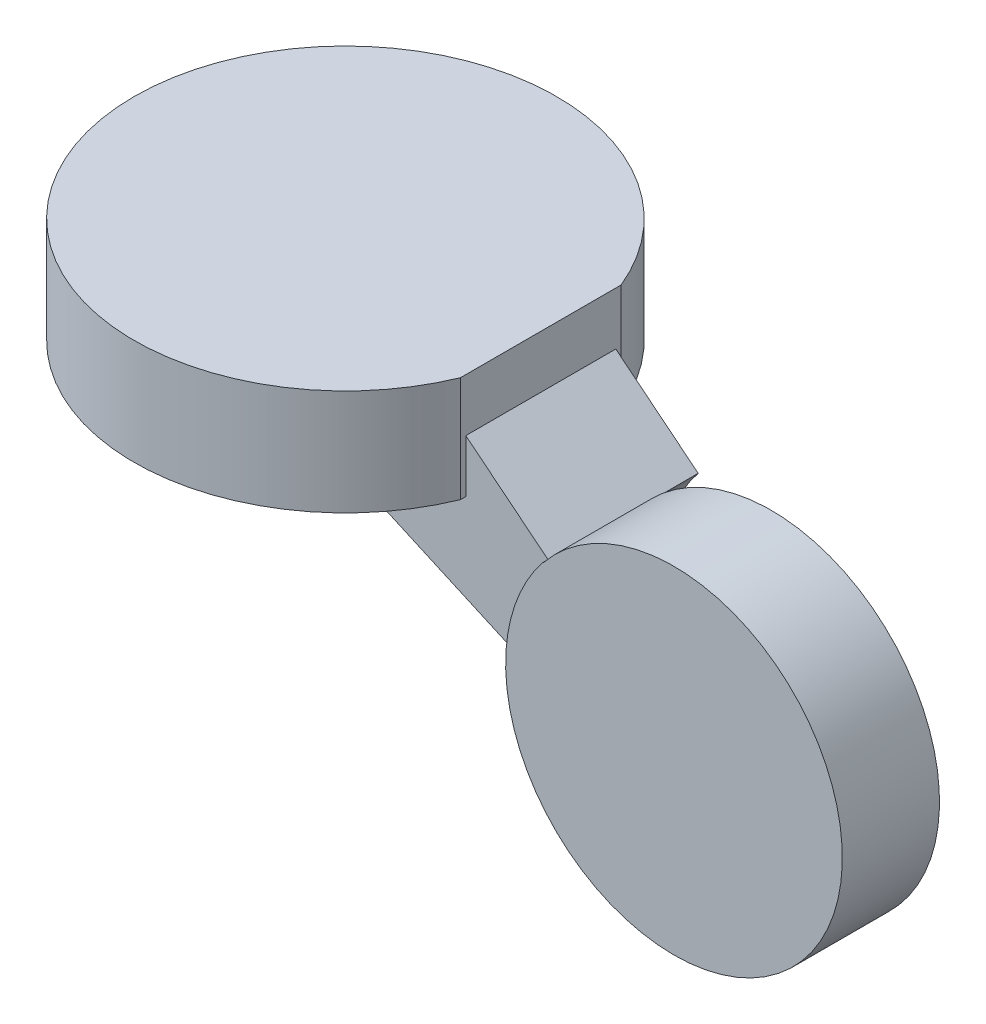
ISO-10303-21;
HEADER;
FILE_DESCRIPTION(('STEP AP214'),'2;1');
FILE_NAME('part.step','',(''),(''),'','','');
FILE_SCHEMA(('AUTOMOTIVE_DESIGN { 1 0 10303 214 1 1 1 1 }'));
ENDSEC;
DATA;
#1=APPLICATION_CONTEXT('core data for automotive mechanical design processes');
#2=APPLICATION_PROTOCOL_DEFINITION('international standard','automotive_design',2000,#1);
#3=PRODUCT_CONTEXT('',#1,'mechanical');
#4=PRODUCT('Part','Part','',(#3));
#5=PRODUCT_RELATED_PRODUCT_CATEGORY('part','',(#4));
#6=PRODUCT_DEFINITION_FORMATION('','',#4);
#7=PRODUCT_DEFINITION_CONTEXT('part definition',#1,'design');
#8=PRODUCT_DEFINITION('design','',#6,#7);
#9=PRODUCT_DEFINITION_SHAPE('','',#8);
#10=(LENGTH_UNIT() NAMED_UNIT(*) SI_UNIT(.MILLI.,.METRE.));
#11=(NAMED_UNIT(*) PLANE_ANGLE_UNIT() SI_UNIT($,.RADIAN.));
#12=(NAMED_UNIT(*) SI_UNIT($,.STERADIAN.) SOLID_ANGLE_UNIT());
#13=UNCERTAINTY_MEASURE_WITH_UNIT(LENGTH_MEASURE(1.E-05),#10,'distance_accuracy_value','');
#14=(GEOMETRIC_REPRESENTATION_CONTEXT(3) GLOBAL_UNCERTAINTY_ASSIGNED_CONTEXT((#13)) GLOBAL_UNIT_ASSIGNED_CONTEXT((#10,
#11,#12)) REPRESENTATION_CONTEXT('',''));
#15=CARTESIAN_POINT('',(0.,0.,0.));
#16=DIRECTION('',(0.,0.,1.));
#17=DIRECTION('',(1.,0.,0.));
#18=AXIS2_PLACEMENT_3D('',#15,#16,#17);
#19=CARTESIAN_POINT('',(185.,50.,-75.9934207678534));
#20=DIRECTION('',(0.627757521800335,0.778408950246015,0.));
#21=DIRECTION('',(-0.778408950246015,0.627757521800335,0.));
#22=AXIS2_PLACEMENT_3D('',#19,#20,#21);
#23=PLANE('',#22);
#24=DIRECTION('',(0.778408950246015,-0.627757521800335,0.));
#25=VECTOR('',#24,1.);
#26=CARTESIAN_POINT('',(185.,50.,-70.9934207678534));
#27=LINE('',#26,#25);
#28=CARTESIAN_POINT('',(185.,50.,-70.9934207678534));
#29=VERTEX_POINT('',#28);
#30=CARTESIAN_POINT('',(263.016769178604,-12.9175880659524,-70.9934207678534));
#31=VERTEX_POINT('',#30);
#32=EDGE_CURVE('E55',#29,#31,#27,.T.);
#33=ORIENTED_EDGE('',*,*,#32,.F.);
#34=DIRECTION('',(0.,0.,1.));
#35=VECTOR('',#34,1.);
#36=CARTESIAN_POINT('',(185.,50.,-75.9934207678534));
#37=LINE('',#36,#35);
#38=CARTESIAN_POINT('',(185.,50.,70.9934207678534));
#39=VERTEX_POINT('',#38);
#40=EDGE_CURVE('E157',#29,#39,#37,.T.);
#41=ORIENTED_EDGE('',*,*,#40,.T.);
#42=DIRECTION('',(-0.778408950246015,0.627757521800335,0.));
#43=VECTOR('',#42,1.);
#44=CARTESIAN_POINT('',(97.3373123204079,120.696658298578,70.9934207678534));
#45=LINE('',#44,#43);
#46=CARTESIAN_POINT('',(262.770904394627,-12.7193073711596,70.9934207678534));
#47=VERTEX_POINT('',#46);
#48=EDGE_CURVE('E347',#47,#39,#45,.T.);
#49=ORIENTED_EDGE('',*,*,#48,.F.);
#50=DIRECTION('',(0.,0.,1.));
#51=VECTOR('',#50,1.);
#52=CARTESIAN_POINT('',(262.770904394627,-12.7193073711596,70.9934207678534));
#53=LINE('',#52,#51);
#54=CARTESIAN_POINT('',(262.770904394627,-12.7193073711596,75.9934207678534));
#55=VERTEX_POINT('',#54);
#56=EDGE_CURVE('E195',#47,#55,#53,.T.);
#57=ORIENTED_EDGE('',*,*,#56,.T.);
#58=DIRECTION('',(-0.778408950246015,0.627757521800335,0.));
#59=VECTOR('',#58,1.);
#60=CARTESIAN_POINT('',(185.,50.,75.9934207678534));
#61=LINE('',#60,#59);
#62=CARTESIAN_POINT('',(263.016769178604,-12.9175880659524,75.9934207678534));
#63=VERTEX_POINT('',#62);
#64=EDGE_CURVE('E152',#63,#55,#61,.T.);
#65=ORIENTED_EDGE('',*,*,#64,.F.);
#66=DIRECTION('',(0.,0.,1.));
#67=VECTOR('',#66,1.);
#68=CARTESIAN_POINT('',(263.016769178604,-12.9175880659524,-75.9934207678534));
#69=LINE('',#68,#67);
#70=CARTESIAN_POINT('',(263.016769178604,-12.9175880659524,-15.9934207678534));
#71=VERTEX_POINT('',#70);
#72=EDGE_CURVE('E146',#71,#63,#69,.T.);
#73=ORIENTED_EDGE('',*,*,#72,.F.);
#74=EDGE_CURVE('E62',#31,#71,#69,.T.);
#75=ORIENTED_EDGE('',*,*,#74,.F.);
#76=EDGE_LOOP('',(#33,#41,#49,#57,#65,#73,#75));
#77=FACE_BOUND('',#76,.T.);
#78=ADVANCED_FACE('F39',(#77),#23,.T.);
#79=CARTESIAN_POINT('',(251.92455713093,-112.966443102881,-75.9934207678534));
#80=DIRECTION('',(-0.409160689592951,-0.91246234447884,0.));
#81=DIRECTION('',(0.91246234447884,-0.409160689592951,0.));
#82=AXIS2_PLACEMENT_3D('',#79,#80,#81);
#83=PLANE('',#82);
#84=DIRECTION('',(-0.91246234447884,0.409160689592951,0.));
#85=VECTOR('',#84,1.);
#86=CARTESIAN_POINT('',(228.060355377864,-102.265406172478,-70.9934207678534));
#87=LINE('',#86,#85);
#88=CARTESIAN_POINT('',(228.060355377864,-102.265406172478,-70.9934207678534));
#89=VERTEX_POINT('',#88);
#90=CARTESIAN_POINT('',(0.,0.,-70.9934207678534));
#91=VERTEX_POINT('',#90);
#92=EDGE_CURVE('E117',#89,#91,#87,.T.);
#93=ORIENTED_EDGE('',*,*,#92,.F.);
#94=DIRECTION('',(0.,0.,1.));
#95=VECTOR('',#94,1.);
#96=CARTESIAN_POINT('',(228.060355377864,-102.265406172478,-75.9934207678534));
#97=LINE('',#96,#95);
#98=CARTESIAN_POINT('',(228.060355377864,-102.265406172478,-15.9934207678534));
#99=VERTEX_POINT('',#98);
#100=EDGE_CURVE('E126',#99,#89,#97,.F.);
#101=ORIENTED_EDGE('',*,*,#100,.F.);
#102=CARTESIAN_POINT('',(228.060355377864,-102.265406172478,70.9934207678534));
#103=VERTEX_POINT('',#102);
#104=EDGE_CURVE('E135',#103,#99,#97,.F.);
#105=ORIENTED_EDGE('',*,*,#104,.F.);
#106=DIRECTION('',(0.91246234447884,-0.409160689592951,0.));
#107=VECTOR('',#106,1.);
#108=CARTESIAN_POINT('',(0.,0.,70.9934207678534));
#109=LINE('',#108,#107);
#110=CARTESIAN_POINT('',(0.,0.,70.9934207678534));
#111=VERTEX_POINT('',#110);
#112=EDGE_CURVE('E348',#111,#103,#109,.T.);
#113=ORIENTED_EDGE('',*,*,#112,.F.);
#114=DIRECTION('',(0.,0.,1.));
#115=VECTOR('',#114,1.);
#116=CARTESIAN_POINT('',(0.,0.,-75.9934207678534));
#117=LINE('',#116,#115);
#118=EDGE_CURVE('E128',#91,#111,#117,.T.);
#119=ORIENTED_EDGE('',*,*,#118,.F.);
#120=EDGE_LOOP('',(#93,#101,#105,#113,#119));
#121=FACE_BOUND('',#120,.T.);
#122=ADVANCED_FACE('F124',(#121),#83,.T.);
#123=CARTESIAN_POINT('',(0.,0.,75.9934207678534));
#124=DIRECTION('',(0.,0.,-1.));
#125=DIRECTION('',(-1.,0.,0.));
#126=AXIS2_PLACEMENT_3D('',#123,#124,#125);
#127=PLANE('',#126);
#128=CARTESIAN_POINT('',(388.832371902994,-113.084659733468,75.9934207678534));
#129=DIRECTION('',(0.,0.,1.));
#130=DIRECTION('',(1.,0.,0.));
#131=AXIS2_PLACEMENT_3D('',#128,#129,#130);
#132=CIRCLE('',#131,161.135649516715);
#133=CARTESIAN_POINT('',(228.060355377864,-102.265406172478,75.9934207678534));
#134=VERTEX_POINT('',#133);
#135=EDGE_CURVE('E350',#55,#134,#132,.T.);
#136=ORIENTED_EDGE('',*,*,#135,.T.);
#137=CARTESIAN_POINT('',(387.075695624063,-112.966443102881,75.9934207678534));
#138=DIRECTION('',(0.,0.,1.));
#139=DIRECTION('',(1.,0.,0.));
#140=AXIS2_PLACEMENT_3D('',#137,#138,#139);
#141=CIRCLE('',#140,159.375);
#142=EDGE_CURVE('E136',#134,#63,#141,.T.);
#143=ORIENTED_EDGE('',*,*,#142,.T.);
#144=ORIENTED_EDGE('',*,*,#64,.T.);
#145=EDGE_LOOP('',(#136,#143,#144));
#146=FACE_BOUND('',#145,.T.);
#147=ADVANCED_FACE('F215',(#146),#127,.F.);
#148=CARTESIAN_POINT('',(387.075695624063,-112.966443102881,-75.9934207678534));
#149=DIRECTION('',(0.,0.,1.));
#150=DIRECTION('',(1.,0.,0.));
#151=AXIS2_PLACEMENT_3D('',#148,#149,#150);
#152=CYLINDRICAL_SURFACE('',#151,159.375);
#153=EDGE_CURVE('E138',#134,#103,#97,.F.);
#154=ORIENTED_EDGE('',*,*,#153,.T.);
#155=ORIENTED_EDGE('',*,*,#104,.T.);
#156=CARTESIAN_POINT('',(387.075695624063,-112.966443102881,-15.9934207678534));
#157=DIRECTION('',(0.,0.,-1.));
#158=DIRECTION('',(-1.,0.,0.));
#159=AXIS2_PLACEMENT_3D('',#156,#157,#158);
#160=CIRCLE('',#159,159.375);
#161=EDGE_CURVE('E11',#99,#71,#160,.F.);
#162=ORIENTED_EDGE('',*,*,#161,.T.);
#163=ORIENTED_EDGE('',*,*,#72,.T.);
#164=ORIENTED_EDGE('',*,*,#142,.F.);
#165=EDGE_LOOP('',(#154,#155,#162,#163,#164));
#166=FACE_BOUND('',#165,.T.);
#167=ADVANCED_FACE('F222',(#166),#152,.T.);
#168=CARTESIAN_POINT('',(0.,0.,0.));
#169=DIRECTION('',(0.,1.,0.));
#170=DIRECTION('',(0.,0.,1.));
#171=AXIS2_PLACEMENT_3D('',#168,#169,#170);
#172=PLANE('',#171);
#173=DIRECTION('',(1.,0.,0.));
#174=VECTOR('',#173,1.);
#175=CARTESIAN_POINT('',(0.,0.,-70.9934207678534));
#176=LINE('',#175,#174);
#177=CARTESIAN_POINT('',(185.,0.,-70.9934207678534));
#178=VERTEX_POINT('',#177);
#179=EDGE_CURVE('E130',#91,#178,#176,.T.);
#180=ORIENTED_EDGE('',*,*,#179,.F.);
#181=ORIENTED_EDGE('',*,*,#118,.T.);
#182=DIRECTION('',(-1.,0.,0.));
#183=VECTOR('',#182,1.);
#184=CARTESIAN_POINT('',(0.,0.,70.9934207678534));
#185=LINE('',#184,#183);
#186=CARTESIAN_POINT('',(185.,0.,70.9934207678534));
#187=VERTEX_POINT('',#186);
#188=EDGE_CURVE('E190',#187,#111,#185,.T.);
#189=ORIENTED_EDGE('',*,*,#188,.F.);
#190=DIRECTION('',(0.,0.,1.));
#191=VECTOR('',#190,1.);
#192=CARTESIAN_POINT('',(185.,0.,70.9934207678534));
#193=LINE('',#192,#191);
#194=CARTESIAN_POINT('',(185.,0.,75.9934207678534));
#195=VERTEX_POINT('',#194);
#196=EDGE_CURVE('E188',#187,#195,#193,.T.);
#197=ORIENTED_EDGE('',*,*,#196,.T.);
#198=CARTESIAN_POINT('',(0.,0.,0.));
#199=DIRECTION('',(0.,1.,0.));
#200=DIRECTION('',(0.,0.,1.));
#201=AXIS2_PLACEMENT_3D('',#198,#199,#200);
#202=CIRCLE('',#201,200.);
#203=CARTESIAN_POINT('',(185.,0.,-75.9934207678534));
#204=VERTEX_POINT('',#203);
#205=EDGE_CURVE('E170',#204,#195,#202,.T.);
#206=ORIENTED_EDGE('',*,*,#205,.F.);
#207=DIRECTION('',(0.,0.,-1.));
#208=VECTOR('',#207,1.);
#209=CARTESIAN_POINT('',(185.,0.,-70.9934207678534));
#210=LINE('',#209,#208);
#211=EDGE_CURVE('E185',#178,#204,#210,.T.);
#212=ORIENTED_EDGE('',*,*,#211,.F.);
#213=EDGE_LOOP('',(#180,#181,#189,#197,#206,#212));
#214=FACE_BOUND('',#213,.T.);
#215=ADVANCED_FACE('F184',(#214),#172,.F.);
#216=CARTESIAN_POINT('',(185.,0.,0.));
#217=DIRECTION('',(1.,0.,0.));
#218=DIRECTION('',(0.,0.,-1.));
#219=AXIS2_PLACEMENT_3D('',#216,#217,#218);
#220=PLANE('',#219);
#221=DIRECTION('',(0.,0.,-1.));
#222=VECTOR('',#221,1.);
#223=CARTESIAN_POINT('',(185.,100.,0.));
#224=LINE('',#223,#222);
#225=CARTESIAN_POINT('',(185.,100.,75.9934207678534));
#226=VERTEX_POINT('',#225);
#227=CARTESIAN_POINT('',(185.,100.,-75.9934207678534));
#228=VERTEX_POINT('',#227);
#229=EDGE_CURVE('E160',#226,#228,#224,.T.);
#230=ORIENTED_EDGE('',*,*,#229,.F.);
#231=DIRECTION('',(0.,1.,0.));
#232=VECTOR('',#231,1.);
#233=CARTESIAN_POINT('',(185.,0.,75.9934207678534));
#234=LINE('',#233,#232);
#235=EDGE_CURVE('E166',#195,#226,#234,.T.);
#236=ORIENTED_EDGE('',*,*,#235,.F.);
#237=ORIENTED_EDGE('',*,*,#196,.F.);
#238=DIRECTION('',(0.,-1.,0.));
#239=VECTOR('',#238,1.);
#240=CARTESIAN_POINT('',(185.,0.,70.9934207678534));
#241=LINE('',#240,#239);
#242=EDGE_CURVE('E356',#39,#187,#241,.T.);
#243=ORIENTED_EDGE('',*,*,#242,.F.);
#244=ORIENTED_EDGE('',*,*,#40,.F.);
#245=DIRECTION('',(0.,1.,0.));
#246=VECTOR('',#245,1.);
#247=CARTESIAN_POINT('',(185.,0.,-70.9934207678534));
#248=LINE('',#247,#246);
#249=EDGE_CURVE('E374',#178,#29,#248,.T.);
#250=ORIENTED_EDGE('',*,*,#249,.F.);
#251=ORIENTED_EDGE('',*,*,#211,.T.);
#252=DIRECTION('',(0.,1.,0.));
#253=VECTOR('',#252,1.);
#254=CARTESIAN_POINT('',(185.,0.,-75.9934207678534));
#255=LINE('',#254,#253);
#256=EDGE_CURVE('E167',#204,#228,#255,.T.);
#257=ORIENTED_EDGE('',*,*,#256,.T.);
#258=EDGE_LOOP('',(#230,#236,#237,#243,#244,#250,#251,#257));
#259=FACE_BOUND('',#258,.T.);
#260=ADVANCED_FACE('F197',(#259),#220,.T.);
#261=CARTESIAN_POINT('',(0.,100.,0.));
#262=DIRECTION('',(0.,-1.,0.));
#263=DIRECTION('',(0.,0.,-1.));
#264=AXIS2_PLACEMENT_3D('',#261,#262,#263);
#265=CYLINDRICAL_SURFACE('',#264,200.);
#266=ORIENTED_EDGE('',*,*,#235,.T.);
#267=CARTESIAN_POINT('',(0.,100.,0.));
#268=DIRECTION('',(0.,1.,0.));
#269=DIRECTION('',(0.,0.,1.));
#270=AXIS2_PLACEMENT_3D('',#267,#268,#269);
#271=CIRCLE('',#270,200.);
#272=EDGE_CURVE('E48',#228,#226,#271,.T.);
#273=ORIENTED_EDGE('',*,*,#272,.F.);
#274=ORIENTED_EDGE('',*,*,#256,.F.);
#275=ORIENTED_EDGE('',*,*,#205,.T.);
#276=EDGE_LOOP('',(#266,#273,#274,#275));
#277=FACE_BOUND('',#276,.T.);
#278=ADVANCED_FACE('F41',(#277),#265,.T.);
#279=CARTESIAN_POINT('',(0.,100.,0.));
#280=DIRECTION('',(0.,1.,0.));
#281=DIRECTION('',(0.,0.,1.));
#282=AXIS2_PLACEMENT_3D('',#279,#280,#281);
#283=PLANE('',#282);
#284=ORIENTED_EDGE('',*,*,#272,.T.);
#285=ORIENTED_EDGE('',*,*,#229,.T.);
#286=EDGE_LOOP('',(#284,#285));
#287=FACE_BOUND('',#286,.T.);
#288=ADVANCED_FACE('F199',(#287),#283,.T.);
#289=CARTESIAN_POINT('',(387.075695624062,-112.966443102881,-15.9934207678534));
#290=DIRECTION('',(0.,0.,-1.));
#291=DIRECTION('',(-1.,0.,0.));
#292=AXIS2_PLACEMENT_3D('',#289,#290,#291);
#293=CYLINDRICAL_SURFACE('',#292,159.375);
#294=ORIENTED_EDGE('',*,*,#100,.T.);
#295=CARTESIAN_POINT('',(387.075695624063,-112.966443102881,-70.9934207678534));
#296=DIRECTION('',(0.,0.,1.));
#297=DIRECTION('',(1.,0.,0.));
#298=AXIS2_PLACEMENT_3D('',#295,#296,#297);
#299=CIRCLE('',#298,159.375000000001);
#300=EDGE_CURVE('E113',#31,#89,#299,.T.);
#301=ORIENTED_EDGE('',*,*,#300,.F.);
#302=ORIENTED_EDGE('',*,*,#74,.T.);
#303=CARTESIAN_POINT('',(387.075695624062,-112.966443102881,-15.9934207678534));
#304=DIRECTION('',(0.,0.,-1.));
#305=DIRECTION('',(-1.,0.,0.));
#306=AXIS2_PLACEMENT_3D('',#303,#304,#305);
#307=CIRCLE('',#306,159.375);
#308=EDGE_CURVE('E133',#99,#71,#307,.T.);
#309=ORIENTED_EDGE('',*,*,#308,.F.);
#310=EDGE_LOOP('',(#294,#301,#302,#309));
#311=FACE_BOUND('',#310,.T.);
#312=ADVANCED_FACE('F132',(#311),#293,.F.);
#313=CARTESIAN_POINT('',(387.075695624062,-112.966443102881,-15.9934207678534));
#314=DIRECTION('',(0.,0.,-1.));
#315=DIRECTION('',(-1.,0.,0.));
#316=AXIS2_PLACEMENT_3D('',#313,#314,#315);
#317=PLANE('',#316);
#318=ORIENTED_EDGE('',*,*,#308,.T.);
#319=ORIENTED_EDGE('',*,*,#161,.F.);
#320=EDGE_LOOP('',(#318,#319));
#321=FACE_BOUND('',#320,.T.);
#322=ADVANCED_FACE('F206',(#321),#317,.T.);
#323=CARTESIAN_POINT('',(388.832371902994,-113.084659733468,70.9934207678534));
#324=DIRECTION('',(0.,0.,1.));
#325=DIRECTION('',(1.,0.,0.));
#326=AXIS2_PLACEMENT_3D('',#323,#324,#325);
#327=CYLINDRICAL_SURFACE('',#326,161.135649516715);
#328=ORIENTED_EDGE('',*,*,#135,.F.);
#329=ORIENTED_EDGE('',*,*,#56,.F.);
#330=CARTESIAN_POINT('',(388.832371902994,-113.084659733468,70.9934207678534));
#331=DIRECTION('',(0.,0.,1.));
#332=DIRECTION('',(1.,0.,0.));
#333=AXIS2_PLACEMENT_3D('',#330,#331,#332);
#334=CIRCLE('',#333,161.135649516715);
#335=EDGE_CURVE('E345',#47,#103,#334,.T.);
#336=ORIENTED_EDGE('',*,*,#335,.T.);
#337=ORIENTED_EDGE('',*,*,#153,.F.);
#338=EDGE_LOOP('',(#328,#329,#336,#337));
#339=FACE_BOUND('',#338,.T.);
#340=ADVANCED_FACE('F234',(#339),#327,.T.);
#341=CARTESIAN_POINT('',(0.,0.,70.9934207678534));
#342=DIRECTION('',(0.,0.,1.));
#343=DIRECTION('',(1.,0.,0.));
#344=AXIS2_PLACEMENT_3D('',#341,#342,#343);
#345=PLANE('',#344);
#346=ORIENTED_EDGE('',*,*,#335,.F.);
#347=ORIENTED_EDGE('',*,*,#48,.T.);
#348=ORIENTED_EDGE('',*,*,#242,.T.);
#349=ORIENTED_EDGE('',*,*,#188,.T.);
#350=ORIENTED_EDGE('',*,*,#112,.T.);
#351=EDGE_LOOP('',(#346,#347,#348,#349,#350));
#352=FACE_BOUND('',#351,.T.);
#353=ADVANCED_FACE('F238',(#352),#345,.T.);
#354=CARTESIAN_POINT('',(387.075695624063,-112.966443102881,-70.9934207678534));
#355=DIRECTION('',(0.,0.,1.));
#356=DIRECTION('',(1.,0.,0.));
#357=AXIS2_PLACEMENT_3D('',#354,#355,#356);
#358=PLANE('',#357);
#359=ORIENTED_EDGE('',*,*,#300,.T.);
#360=ORIENTED_EDGE('',*,*,#92,.T.);
#361=ORIENTED_EDGE('',*,*,#179,.T.);
#362=ORIENTED_EDGE('',*,*,#249,.T.);
#363=ORIENTED_EDGE('',*,*,#32,.T.);
#364=EDGE_LOOP('',(#359,#360,#361,#362,#363));
#365=FACE_BOUND('',#364,.T.);
#366=ADVANCED_FACE('F115',(#365),#358,.F.);
#367=CLOSED_SHELL('',(#78,#122,#147,#167,#215,#260,#278,#288,#312,#322,#340,#353,#366));
#368=MANIFOLD_SOLID_BREP('B2',#367);
#369=ADVANCED_BREP_SHAPE_REPRESENTATION('',(#18,#368),#14);
#370=SHAPE_DEFINITION_REPRESENTATION(#9,#369);
ENDSEC;
END-ISO-10303-21;
